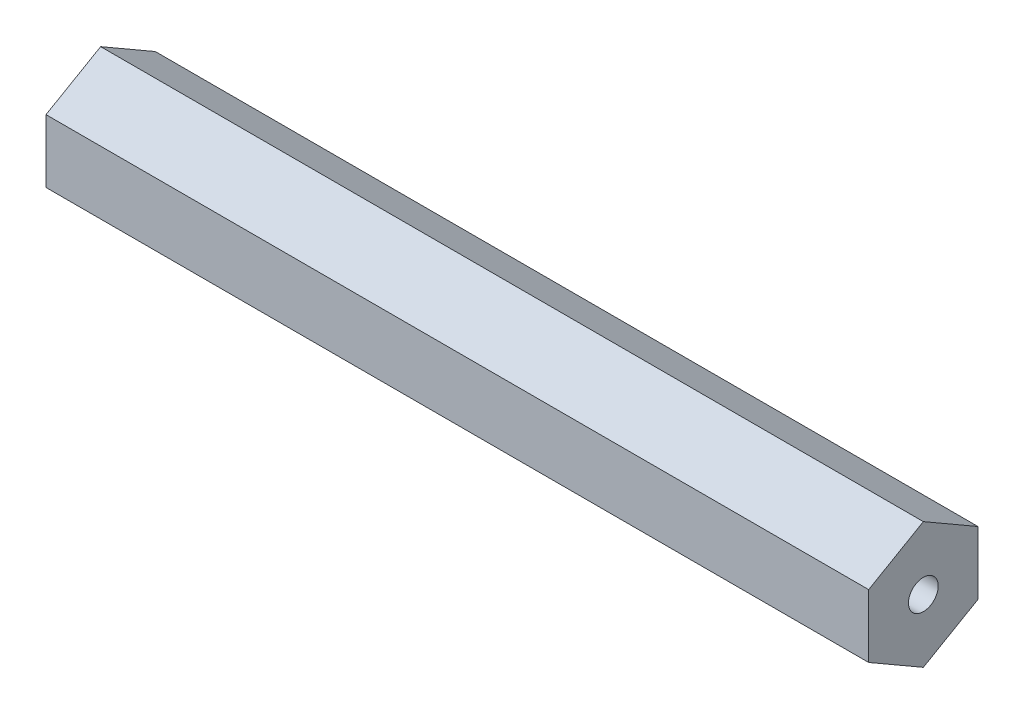
ISO-10303-21;
HEADER;
FILE_DESCRIPTION(('STEP AP214'),'2;1');
FILE_NAME('part.step','',(''),(''),'','','');
FILE_SCHEMA(('AUTOMOTIVE_DESIGN { 1 0 10303 214 1 1 1 1 }'));
ENDSEC;
DATA;
#1=APPLICATION_CONTEXT('core data for automotive mechanical design processes');
#2=APPLICATION_PROTOCOL_DEFINITION('international standard','automotive_design',2000,#1);
#3=PRODUCT_CONTEXT('',#1,'mechanical');
#4=PRODUCT('Part','Part','',(#3));
#5=PRODUCT_RELATED_PRODUCT_CATEGORY('part','',(#4));
#6=PRODUCT_DEFINITION_FORMATION('','',#4);
#7=PRODUCT_DEFINITION_CONTEXT('part definition',#1,'design');
#8=PRODUCT_DEFINITION('design','',#6,#7);
#9=PRODUCT_DEFINITION_SHAPE('','',#8);
#10=(LENGTH_UNIT() NAMED_UNIT(*) SI_UNIT(.MILLI.,.METRE.));
#11=(NAMED_UNIT(*) PLANE_ANGLE_UNIT() SI_UNIT($,.RADIAN.));
#12=(NAMED_UNIT(*) SI_UNIT($,.STERADIAN.) SOLID_ANGLE_UNIT());
#13=UNCERTAINTY_MEASURE_WITH_UNIT(LENGTH_MEASURE(1.E-05),#10,'distance_accuracy_value','');
#14=(GEOMETRIC_REPRESENTATION_CONTEXT(3) GLOBAL_UNCERTAINTY_ASSIGNED_CONTEXT((#13)) GLOBAL_UNIT_ASSIGNED_CONTEXT((#10,
#11,#12)) REPRESENTATION_CONTEXT('',''));
#15=CARTESIAN_POINT('',(0.,0.,0.));
#16=DIRECTION('',(0.,0.,1.));
#17=DIRECTION('',(1.,0.,0.));
#18=AXIS2_PLACEMENT_3D('',#15,#16,#17);
#19=CARTESIAN_POINT('',(22.3900999998818,0.,0.));
#20=DIRECTION('',(1.,0.,0.));
#21=DIRECTION('',(0.,0.,-1.));
#22=AXIS2_PLACEMENT_3D('',#19,#20,#21);
#23=CONICAL_SURFACE('',#22,1.72719999989113,1.02974425864041);
#24=CARTESIAN_POINT('',(21.3522935387402,-2.8421709430404E-11,0.));
#25=VERTEX_POINT('',#24);
#26=VERTEX_LOOP('',#25);
#27=FACE_BOUND('',#26,.T.);
#28=CARTESIAN_POINT('',(22.3901,0.,0.));
#29=DIRECTION('',(1.,0.,0.));
#30=DIRECTION('',(0.,0.,-1.));
#31=AXIS2_PLACEMENT_3D('',#28,#29,#30);
#32=CIRCLE('',#31,1.7272);
#33=CARTESIAN_POINT('',(22.3901,0.,-1.7272));
#34=VERTEX_POINT('',#33);
#35=EDGE_CURVE('E78',#34,#34,#32,.T.);
#36=ORIENTED_EDGE('',*,*,#35,.T.);
#37=EDGE_LOOP('',(#36));
#38=FACE_BOUND('',#37,.T.);
#39=ADVANCED_FACE('F16',(#27,#38),#23,.F.);
#40=CARTESIAN_POINT('',(-22.3900999998818,0.,0.));
#41=DIRECTION('',(-1.,0.,0.));
#42=DIRECTION('',(0.,0.,1.));
#43=AXIS2_PLACEMENT_3D('',#40,#41,#42);
#44=CONICAL_SURFACE('',#43,1.72719999989113,1.02974425864041);
#45=CARTESIAN_POINT('',(-21.3522935387402,-2.8421709430404E-11,0.));
#46=VERTEX_POINT('',#45);
#47=VERTEX_LOOP('',#46);
#48=FACE_BOUND('',#47,.T.);
#49=CARTESIAN_POINT('',(-22.3901,0.,0.));
#50=DIRECTION('',(1.,0.,0.));
#51=DIRECTION('',(0.,0.,-1.));
#52=AXIS2_PLACEMENT_3D('',#49,#50,#51);
#53=CIRCLE('',#52,1.7272);
#54=CARTESIAN_POINT('',(-22.3901,0.,-1.7272));
#55=VERTEX_POINT('',#54);
#56=EDGE_CURVE('E86',#55,#55,#53,.F.);
#57=ORIENTED_EDGE('',*,*,#56,.T.);
#58=EDGE_LOOP('',(#57));
#59=FACE_BOUND('',#58,.T.);
#60=ADVANCED_FACE('F75',(#48,#59),#44,.F.);
#61=CARTESIAN_POINT('',(20.0304032157556,0.,0.));
#62=DIRECTION('',(1.,0.,0.));
#63=DIRECTION('',(0.,0.,-1.));
#64=AXIS2_PLACEMENT_3D('',#61,#62,#63);
#65=CYLINDRICAL_SURFACE('',#64,1.7272);
#66=ORIENTED_EDGE('',*,*,#35,.F.);
#67=EDGE_LOOP('',(#66));
#68=FACE_BOUND('',#67,.T.);
#69=CARTESIAN_POINT('',(47.7901,0.,0.));
#70=DIRECTION('',(1.,0.,0.));
#71=DIRECTION('',(0.,0.,-1.));
#72=AXIS2_PLACEMENT_3D('',#69,#70,#71);
#73=CIRCLE('',#72,1.7272);
#74=CARTESIAN_POINT('',(47.7901,0.,-1.7272));
#75=VERTEX_POINT('',#74);
#76=EDGE_CURVE('E19',#75,#75,#73,.F.);
#77=ORIENTED_EDGE('',*,*,#76,.F.);
#78=EDGE_LOOP('',(#77));
#79=FACE_BOUND('',#78,.T.);
#80=ADVANCED_FACE('F188',(#68,#79),#65,.F.);
#81=CARTESIAN_POINT('',(-47.7901,-3.66617420935396,6.35));
#82=DIRECTION('',(0.,-0.866025403784429,0.500000000000017));
#83=DIRECTION('',(0.,-0.500000000000017,-0.866025403784429));
#84=AXIS2_PLACEMENT_3D('',#81,#82,#83);
#85=PLANE('',#84);
#86=DIRECTION('',(1.,0.,0.));
#87=VECTOR('',#86,1.);
#88=CARTESIAN_POINT('',(-47.7901,-3.66617420935396,6.35));
#89=LINE('',#88,#87);
#90=CARTESIAN_POINT('',(-47.7901,-3.66617420935396,6.35));
#91=VERTEX_POINT('',#90);
#92=CARTESIAN_POINT('',(47.7901,-3.66617420935396,6.35));
#93=VERTEX_POINT('',#92);
#94=EDGE_CURVE('E123',#91,#93,#89,.T.);
#95=ORIENTED_EDGE('',*,*,#94,.F.);
#96=DIRECTION('',(0.,-0.499999999999983,-0.866025403784448));
#97=VECTOR('',#96,1.);
#98=CARTESIAN_POINT('',(-47.7901,-3.66617420935396,6.35));
#99=LINE('',#98,#97);
#100=CARTESIAN_POINT('',(-47.7901,-7.33234841870804,0.));
#101=VERTEX_POINT('',#100);
#102=EDGE_CURVE('E102',#91,#101,#99,.T.);
#103=ORIENTED_EDGE('',*,*,#102,.T.);
#104=DIRECTION('',(1.,0.,0.));
#105=VECTOR('',#104,1.);
#106=CARTESIAN_POINT('',(-47.7901,-7.33234841870792,0.));
#107=LINE('',#106,#105);
#108=CARTESIAN_POINT('',(47.7901,-7.33234841870804,0.));
#109=VERTEX_POINT('',#108);
#110=EDGE_CURVE('E80',#109,#101,#107,.F.);
#111=ORIENTED_EDGE('',*,*,#110,.F.);
#112=DIRECTION('',(0.,-0.499999999999983,-0.866025403784448));
#113=VECTOR('',#112,1.);
#114=CARTESIAN_POINT('',(47.7901,-3.66617420935396,6.35));
#115=LINE('',#114,#113);
#116=EDGE_CURVE('E120',#93,#109,#115,.T.);
#117=ORIENTED_EDGE('',*,*,#116,.F.);
#118=EDGE_LOOP('',(#95,#103,#111,#117));
#119=FACE_BOUND('',#118,.T.);
#120=ADVANCED_FACE('F178',(#119),#85,.T.);
#121=CARTESIAN_POINT('',(-47.7901,-7.33234841870792,0.));
#122=DIRECTION('',(0.,-0.866025403784429,-0.500000000000017));
#123=DIRECTION('',(0.,0.500000000000017,-0.866025403784429));
#124=AXIS2_PLACEMENT_3D('',#121,#122,#123);
#125=PLANE('',#124);
#126=ORIENTED_EDGE('',*,*,#110,.T.);
#127=DIRECTION('',(0.,0.499999999999983,-0.866025403784448));
#128=VECTOR('',#127,1.);
#129=CARTESIAN_POINT('',(-47.7901,-7.33234841870792,0.));
#130=LINE('',#129,#128);
#131=CARTESIAN_POINT('',(-47.7901,-3.66617420935384,-6.34999999999993));
#132=VERTEX_POINT('',#131);
#133=EDGE_CURVE('E97',#101,#132,#130,.T.);
#134=ORIENTED_EDGE('',*,*,#133,.T.);
#135=DIRECTION('',(-1.,0.,0.));
#136=VECTOR('',#135,1.);
#137=CARTESIAN_POINT('',(-47.7901,-3.66617420935396,-6.35));
#138=LINE('',#137,#136);
#139=CARTESIAN_POINT('',(47.7901,-3.66617420935384,-6.34999999999993));
#140=VERTEX_POINT('',#139);
#141=EDGE_CURVE('E83',#140,#132,#138,.T.);
#142=ORIENTED_EDGE('',*,*,#141,.F.);
#143=DIRECTION('',(0.,0.499999999999983,-0.866025403784448));
#144=VECTOR('',#143,1.);
#145=CARTESIAN_POINT('',(47.7901,-7.33234841870792,0.));
#146=LINE('',#145,#144);
#147=EDGE_CURVE('E117',#109,#140,#146,.T.);
#148=ORIENTED_EDGE('',*,*,#147,.F.);
#149=EDGE_LOOP('',(#126,#134,#142,#148));
#150=FACE_BOUND('',#149,.T.);
#151=ADVANCED_FACE('F147',(#150),#125,.T.);
#152=CARTESIAN_POINT('',(-47.7901,-3.66617420935396,-6.35));
#153=DIRECTION('',(0.,0.,-1.));
#154=DIRECTION('',(-1.,0.,0.));
#155=AXIS2_PLACEMENT_3D('',#152,#153,#154);
#156=PLANE('',#155);
#157=ORIENTED_EDGE('',*,*,#141,.T.);
#158=DIRECTION('',(0.,1.,0.));
#159=VECTOR('',#158,1.);
#160=CARTESIAN_POINT('',(-47.7901,0.,-6.35));
#161=LINE('',#160,#159);
#162=CARTESIAN_POINT('',(-47.7901,3.66617420935396,-6.35));
#163=VERTEX_POINT('',#162);
#164=EDGE_CURVE('E95',#132,#163,#161,.T.);
#165=ORIENTED_EDGE('',*,*,#164,.T.);
#166=DIRECTION('',(1.,0.,0.));
#167=VECTOR('',#166,1.);
#168=CARTESIAN_POINT('',(-47.7901,3.66617420935396,-6.35));
#169=LINE('',#168,#167);
#170=CARTESIAN_POINT('',(47.7901,3.66617420935396,-6.35));
#171=VERTEX_POINT('',#170);
#172=EDGE_CURVE('E107',#171,#163,#169,.F.);
#173=ORIENTED_EDGE('',*,*,#172,.F.);
#174=DIRECTION('',(0.,1.,0.));
#175=VECTOR('',#174,1.);
#176=CARTESIAN_POINT('',(47.7901,0.,-6.35));
#177=LINE('',#176,#175);
#178=EDGE_CURVE('E115',#140,#171,#177,.T.);
#179=ORIENTED_EDGE('',*,*,#178,.F.);
#180=EDGE_LOOP('',(#157,#165,#173,#179));
#181=FACE_BOUND('',#180,.T.);
#182=ADVANCED_FACE('F137',(#181),#156,.T.);
#183=CARTESIAN_POINT('',(-20.0304032157556,0.,0.));
#184=DIRECTION('',(1.,0.,0.));
#185=DIRECTION('',(0.,0.,-1.));
#186=AXIS2_PLACEMENT_3D('',#183,#184,#185);
#187=CYLINDRICAL_SURFACE('',#186,1.7272);
#188=ORIENTED_EDGE('',*,*,#56,.F.);
#189=EDGE_LOOP('',(#188));
#190=FACE_BOUND('',#189,.T.);
#191=CARTESIAN_POINT('',(-47.7901,0.,0.));
#192=DIRECTION('',(1.,0.,0.));
#193=DIRECTION('',(0.,0.,-1.));
#194=AXIS2_PLACEMENT_3D('',#191,#192,#193);
#195=CIRCLE('',#194,1.7272);
#196=CARTESIAN_POINT('',(-47.7901,0.,-1.7272));
#197=VERTEX_POINT('',#196);
#198=EDGE_CURVE('E87',#197,#197,#195,.F.);
#199=ORIENTED_EDGE('',*,*,#198,.T.);
#200=EDGE_LOOP('',(#199));
#201=FACE_BOUND('',#200,.T.);
#202=ADVANCED_FACE('F134',(#190,#201),#187,.F.);
#203=CARTESIAN_POINT('',(-47.7901,3.66617420935396,6.35));
#204=DIRECTION('',(0.,0.,1.));
#205=DIRECTION('',(1.,0.,0.));
#206=AXIS2_PLACEMENT_3D('',#203,#204,#205);
#207=PLANE('',#206);
#208=DIRECTION('',(1.,0.,0.));
#209=VECTOR('',#208,1.);
#210=CARTESIAN_POINT('',(-47.7901,3.66617420935371,6.34999999999986));
#211=LINE('',#210,#209);
#212=CARTESIAN_POINT('',(-47.7901,3.6661742093539,6.34999999999997));
#213=VERTEX_POINT('',#212);
#214=CARTESIAN_POINT('',(47.7901,3.6661742093539,6.34999999999997));
#215=VERTEX_POINT('',#214);
#216=EDGE_CURVE('E89',#213,#215,#211,.T.);
#217=ORIENTED_EDGE('',*,*,#216,.F.);
#218=DIRECTION('',(0.,1.,0.));
#219=VECTOR('',#218,1.);
#220=CARTESIAN_POINT('',(-47.7901,0.,6.35));
#221=LINE('',#220,#219);
#222=EDGE_CURVE('E104',#213,#91,#221,.F.);
#223=ORIENTED_EDGE('',*,*,#222,.T.);
#224=ORIENTED_EDGE('',*,*,#94,.T.);
#225=DIRECTION('',(0.,1.,0.));
#226=VECTOR('',#225,1.);
#227=CARTESIAN_POINT('',(47.7901,0.,6.35));
#228=LINE('',#227,#226);
#229=EDGE_CURVE('E112',#215,#93,#228,.F.);
#230=ORIENTED_EDGE('',*,*,#229,.F.);
#231=EDGE_LOOP('',(#217,#223,#224,#230));
#232=FACE_BOUND('',#231,.T.);
#233=ADVANCED_FACE('F136',(#232),#207,.T.);
#234=CARTESIAN_POINT('',(47.7901,0.,0.));
#235=DIRECTION('',(1.,0.,0.));
#236=DIRECTION('',(0.,0.,-1.));
#237=AXIS2_PLACEMENT_3D('',#234,#235,#236);
#238=PLANE('',#237);
#239=ORIENTED_EDGE('',*,*,#76,.T.);
#240=EDGE_LOOP('',(#239));
#241=FACE_BOUND('',#240,.T.);
#242=DIRECTION('',(0.,-0.500000000000017,0.866025403784429));
#243=VECTOR('',#242,1.);
#244=CARTESIAN_POINT('',(47.7901,7.33234841870792,0.));
#245=LINE('',#244,#243);
#246=CARTESIAN_POINT('',(47.7901,7.33234841870798,0.));
#247=VERTEX_POINT('',#246);
#248=EDGE_CURVE('E93',#215,#247,#245,.F.);
#249=ORIENTED_EDGE('',*,*,#248,.F.);
#250=ORIENTED_EDGE('',*,*,#229,.T.);
#251=ORIENTED_EDGE('',*,*,#116,.T.);
#252=ORIENTED_EDGE('',*,*,#147,.T.);
#253=ORIENTED_EDGE('',*,*,#178,.T.);
#254=DIRECTION('',(0.,0.500000000000017,0.866025403784429));
#255=VECTOR('',#254,1.);
#256=CARTESIAN_POINT('',(47.7901,3.66617420935396,-6.35));
#257=LINE('',#256,#255);
#258=EDGE_CURVE('E109',#247,#171,#257,.F.);
#259=ORIENTED_EDGE('',*,*,#258,.F.);
#260=EDGE_LOOP('',(#249,#250,#251,#252,#253,#259));
#261=FACE_BOUND('',#260,.T.);
#262=ADVANCED_FACE('F144',(#241,#261),#238,.T.);
#263=CARTESIAN_POINT('',(-47.7901,3.66617420935396,-6.35));
#264=DIRECTION('',(0.,0.866025403784429,-0.500000000000017));
#265=DIRECTION('',(0.,0.500000000000017,0.866025403784429));
#266=AXIS2_PLACEMENT_3D('',#263,#264,#265);
#267=PLANE('',#266);
#268=ORIENTED_EDGE('',*,*,#172,.T.);
#269=DIRECTION('',(0.,0.499999999999983,0.866025403784448));
#270=VECTOR('',#269,1.);
#271=CARTESIAN_POINT('',(-47.7901,3.66617420935396,-6.35));
#272=LINE('',#271,#270);
#273=CARTESIAN_POINT('',(-47.7901,7.33234841870804,0.));
#274=VERTEX_POINT('',#273);
#275=EDGE_CURVE('E34',#163,#274,#272,.T.);
#276=ORIENTED_EDGE('',*,*,#275,.T.);
#277=DIRECTION('',(1.,0.,0.));
#278=VECTOR('',#277,1.);
#279=CARTESIAN_POINT('',(-47.7901,7.33234841870792,0.));
#280=LINE('',#279,#278);
#281=EDGE_CURVE('E25',#247,#274,#280,.F.);
#282=ORIENTED_EDGE('',*,*,#281,.F.);
#283=ORIENTED_EDGE('',*,*,#258,.T.);
#284=EDGE_LOOP('',(#268,#276,#282,#283));
#285=FACE_BOUND('',#284,.T.);
#286=ADVANCED_FACE('F157',(#285),#267,.T.);
#287=CARTESIAN_POINT('',(-47.7901,0.,0.));
#288=DIRECTION('',(1.,0.,0.));
#289=DIRECTION('',(0.,0.,-1.));
#290=AXIS2_PLACEMENT_3D('',#287,#288,#289);
#291=PLANE('',#290);
#292=ORIENTED_EDGE('',*,*,#198,.F.);
#293=EDGE_LOOP('',(#292));
#294=FACE_BOUND('',#293,.T.);
#295=ORIENTED_EDGE('',*,*,#275,.F.);
#296=ORIENTED_EDGE('',*,*,#164,.F.);
#297=ORIENTED_EDGE('',*,*,#133,.F.);
#298=ORIENTED_EDGE('',*,*,#102,.F.);
#299=ORIENTED_EDGE('',*,*,#222,.F.);
#300=DIRECTION('',(0.,-0.500000000000017,0.866025403784429));
#301=VECTOR('',#300,1.);
#302=CARTESIAN_POINT('',(-47.7901,7.33234841870792,0.));
#303=LINE('',#302,#301);
#304=EDGE_CURVE('E11',#274,#213,#303,.T.);
#305=ORIENTED_EDGE('',*,*,#304,.F.);
#306=EDGE_LOOP('',(#295,#296,#297,#298,#299,#305));
#307=FACE_BOUND('',#306,.T.);
#308=ADVANCED_FACE('F151',(#294,#307),#291,.F.);
#309=CARTESIAN_POINT('',(-47.7901,7.33234841870792,0.));
#310=DIRECTION('',(0.,0.866025403784429,0.500000000000017));
#311=DIRECTION('',(0.,-0.500000000000017,0.866025403784429));
#312=AXIS2_PLACEMENT_3D('',#309,#310,#311);
#313=PLANE('',#312);
#314=ORIENTED_EDGE('',*,*,#281,.T.);
#315=ORIENTED_EDGE('',*,*,#304,.T.);
#316=ORIENTED_EDGE('',*,*,#216,.T.);
#317=ORIENTED_EDGE('',*,*,#248,.T.);
#318=EDGE_LOOP('',(#314,#315,#316,#317));
#319=FACE_BOUND('',#318,.T.);
#320=ADVANCED_FACE('F149',(#319),#313,.T.);
#321=CLOSED_SHELL('',(#39,#60,#80,#120,#151,#182,#202,#233,#262,#286,#308,#320));
#322=MANIFOLD_SOLID_BREP('B1',#321);
#323=ADVANCED_BREP_SHAPE_REPRESENTATION('',(#18,#322),#14);
#324=SHAPE_DEFINITION_REPRESENTATION(#9,#323);
ENDSEC;
END-ISO-10303-21;
